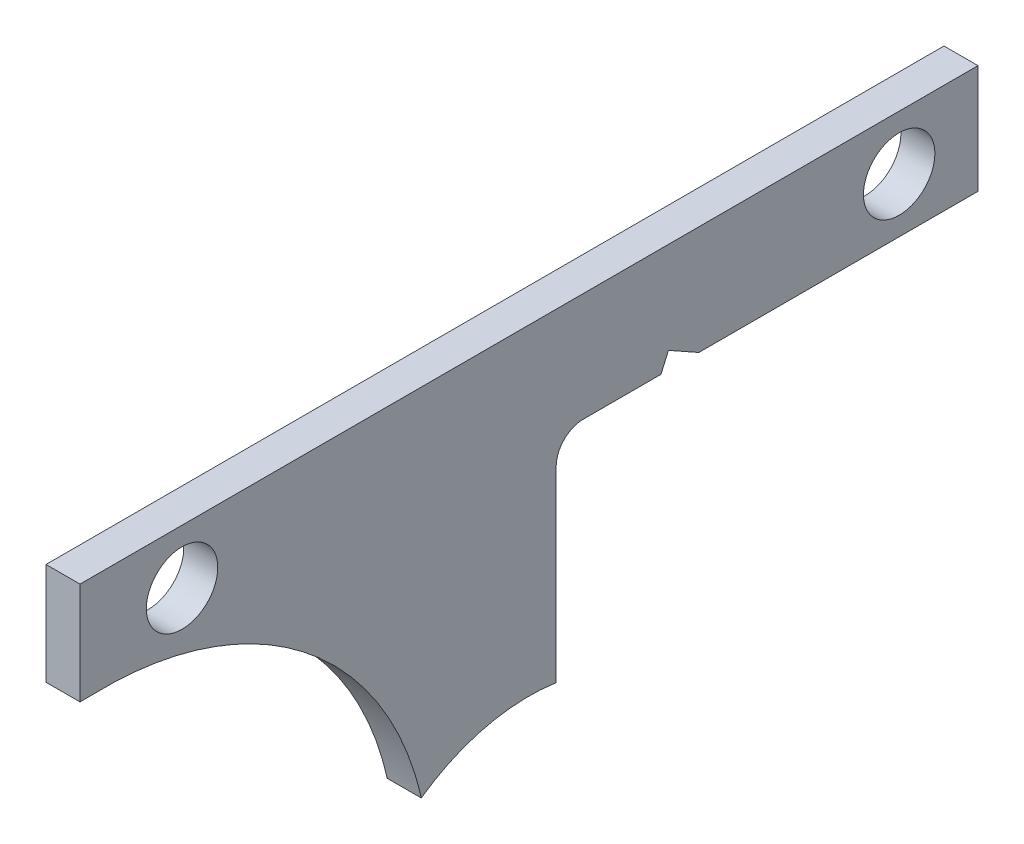
ISO-10303-21;
HEADER;
FILE_DESCRIPTION(('STEP AP214'),'2;1');
FILE_NAME('part.step','',(''),(''),'','','');
FILE_SCHEMA(('AUTOMOTIVE_DESIGN { 1 0 10303 214 1 1 1 1 }'));
ENDSEC;
DATA;
#1=APPLICATION_CONTEXT('core data for automotive mechanical design processes');
#2=APPLICATION_PROTOCOL_DEFINITION('international standard','automotive_design',2000,#1);
#3=PRODUCT_CONTEXT('',#1,'mechanical');
#4=PRODUCT('Part','Part','',(#3));
#5=PRODUCT_RELATED_PRODUCT_CATEGORY('part','',(#4));
#6=PRODUCT_DEFINITION_FORMATION('','',#4);
#7=PRODUCT_DEFINITION_CONTEXT('part definition',#1,'design');
#8=PRODUCT_DEFINITION('design','',#6,#7);
#9=PRODUCT_DEFINITION_SHAPE('','',#8);
#10=(LENGTH_UNIT() NAMED_UNIT(*) SI_UNIT(.MILLI.,.METRE.));
#11=(NAMED_UNIT(*) PLANE_ANGLE_UNIT() SI_UNIT($,.RADIAN.));
#12=(NAMED_UNIT(*) SI_UNIT($,.STERADIAN.) SOLID_ANGLE_UNIT());
#13=UNCERTAINTY_MEASURE_WITH_UNIT(LENGTH_MEASURE(1.E-05),#10,'distance_accuracy_value','');
#14=(GEOMETRIC_REPRESENTATION_CONTEXT(3) GLOBAL_UNCERTAINTY_ASSIGNED_CONTEXT((#13)) GLOBAL_UNIT_ASSIGNED_CONTEXT((#10,
#11,#12)) REPRESENTATION_CONTEXT('',''));
#15=CARTESIAN_POINT('',(0.,0.,0.));
#16=DIRECTION('',(0.,0.,1.));
#17=DIRECTION('',(1.,0.,0.));
#18=AXIS2_PLACEMENT_3D('',#15,#16,#17);
#19=CARTESIAN_POINT('',(-316.5,185.,219.999999999998));
#20=CARTESIAN_POINT('',(-316.5,183.738271044699,181.204081790223));
#21=CARTESIAN_POINT('',(-316.5,145.523335737097,174.397177271133));
#22=CARTESIAN_POINT('',(-321.5,185.,219.999999999998));
#23=CARTESIAN_POINT('',(-321.5,183.738271044699,181.204081790223));
#24=CARTESIAN_POINT('',(-321.5,145.523335737097,174.397177271133));
#25=(BOUNDED_SURFACE() B_SPLINE_SURFACE(1,2,((#19,#20,#21),(#22,#23,#24)),.UNSPECIFIED.,.F.,.F.,
.F.) B_SPLINE_SURFACE_WITH_KNOTS((2,2),(3,3),(-0.0104379405019257,0.0939414645173316),
(0.0325107499581212,1.3945234553188),
.UNSPECIFIED.) GEOMETRIC_REPRESENTATION_ITEM() RATIONAL_B_SPLINE_SURFACE(((1.,0.776939537570949,
1.),(1.,0.776939537570949,1.))) REPRESENTATION_ITEM('') SURFACE());
#26=DIRECTION('',(-1.,0.,0.));
#27=VECTOR('',#26,1.);
#28=CARTESIAN_POINT('',(-319.,147.687279046707,174.834294595081));
#29=LINE('',#28,#27);
#30=CARTESIAN_POINT('',(-316.5,147.687279046707,174.834294595081));
#31=VERTEX_POINT('',#30);
#32=CARTESIAN_POINT('',(-321.5,147.687279046707,174.834294595081));
#33=VERTEX_POINT('',#32);
#34=EDGE_CURVE('E321',#31,#33,#29,.T.);
#35=CARTESIAN_POINT('',(-316.5,185.,219.999999999998));
#36=CARTESIAN_POINT('',(-316.5,183.738271044699,181.204081790223));
#37=CARTESIAN_POINT('',(-316.5,145.523335737097,174.397177271133));
#38=(BOUNDED_CURVE() B_SPLINE_CURVE(2,(#35,#36,#37),.UNSPECIFIED.,.F.,
.F.) B_SPLINE_CURVE_WITH_KNOTS((3,3),(0.0325107499581212,1.3945234553188),
.UNSPECIFIED.) CURVE() GEOMETRIC_REPRESENTATION_ITEM() RATIONAL_B_SPLINE_CURVE((1.,
0.776939537570949,1.)) REPRESENTATION_ITEM(''));
#39=CARTESIAN_POINT('',(-316.5,185.,219.999999999998));
#40=VERTEX_POINT('',#39);
#41=EDGE_CURVE('E71',#40,#31,#38,.T.);
#42=CARTESIAN_POINT('',(-321.5,185.,219.999999999998));
#43=CARTESIAN_POINT('',(-316.5,185.,219.999999999998));
#44=(BOUNDED_CURVE() B_SPLINE_CURVE(1,(#42,#43),.UNSPECIFIED.,.F.,
.F.) B_SPLINE_CURVE_WITH_KNOTS((2,2),(-0.05,0.45),
.UNSPECIFIED.) CURVE() GEOMETRIC_REPRESENTATION_ITEM() RATIONAL_B_SPLINE_CURVE((1.,1.)) REPRESENTATION_ITEM(''));
#45=CARTESIAN_POINT('',(-321.5,185.,219.999999999998));
#46=VERTEX_POINT('',#45);
#47=EDGE_CURVE('E329',#46,#40,#44,.T.);
#48=CARTESIAN_POINT('',(-321.5,145.523335737097,174.397177271133));
#49=CARTESIAN_POINT('',(-321.5,183.738271044699,181.204081790223));
#50=CARTESIAN_POINT('',(-321.5,185.,219.999999999998));
#51=(BOUNDED_CURVE() B_SPLINE_CURVE(2,(#48,#49,#50),.UNSPECIFIED.,.F.,
.F.) B_SPLINE_CURVE_WITH_KNOTS((3,3),(-1.3945234553188,-0.0325107499581212),
.UNSPECIFIED.) CURVE() GEOMETRIC_REPRESENTATION_ITEM() RATIONAL_B_SPLINE_CURVE((1.,
0.776939537570949,1.)) REPRESENTATION_ITEM(''));
#52=EDGE_CURVE('E56',#33,#46,#51,.T.);
#53=ORIENTED_EDGE('',*,*,#34,.F.);
#54=ORIENTED_EDGE('',*,*,#41,.F.);
#55=ORIENTED_EDGE('',*,*,#47,.F.);
#56=ORIENTED_EDGE('',*,*,#52,.F.);
#57=EDGE_LOOP('',(#53,#54,#55,#56));
#58=FACE_BOUND('',#57,.T.);
#59=ADVANCED_FACE('F40',(#58),#25,.T.);
#60=CARTESIAN_POINT('',(-321.5,145.513335737097,225.009999999998));
#61=CARTESIAN_POINT('',(-321.5,145.513335737097,92.9900013881491));
#62=CARTESIAN_POINT('',(-321.5,200.01,225.009999999998));
#63=CARTESIAN_POINT('',(-321.5,200.01,92.9900013881491));
#64=(BOUNDED_SURFACE() B_SPLINE_SURFACE(1,1,((#60,#61),(#62,#63)),.UNSPECIFIED.,.F.,.F.,
.F.) B_SPLINE_SURFACE_WITH_KNOTS((2,2),(2,2),(1.2513335737095,6.70099999999985),
(-6.50099999999984,6.70099986118509),
.UNSPECIFIED.) GEOMETRIC_REPRESENTATION_ITEM() RATIONAL_B_SPLINE_SURFACE(((1.,1.),(1.,1.))) REPRESENTATION_ITEM('') SURFACE());
#65=CARTESIAN_POINT('',(-321.5,145.513335737097,177.509988966474));
#66=CARTESIAN_POINT('',(-321.5,145.860241466454,177.134298435819));
#67=CARTESIAN_POINT('',(-321.5,146.196555668788,176.748831014763));
#68=CARTESIAN_POINT('',(-321.5,146.846977267034,175.959625589369));
#69=CARTESIAN_POINT('',(-321.5,147.161085714723,175.555888451864));
#70=CARTESIAN_POINT('',(-321.5,147.766100139132,174.731397735366));
#71=CARTESIAN_POINT('',(-321.5,148.057006498328,174.310644437049));
#72=CARTESIAN_POINT('',(-321.5,148.614508137317,173.453755060214));
#73=CARTESIAN_POINT('',(-321.5,148.881120474514,173.017630077583));
#74=CARTESIAN_POINT('',(-321.5,149.389422786654,172.13108852765));
#75=CARTESIAN_POINT('',(-321.5,149.63111302594,171.680672112001));
#76=CARTESIAN_POINT('',(-321.5,150.088798717896,170.76700190475));
#77=CARTESIAN_POINT('',(-321.5,150.30479431651,170.303748186083));
#78=CARTESIAN_POINT('',(-321.5,150.811946808464,169.13105253283));
#79=CARTESIAN_POINT('',(-321.5,151.086629618675,168.414415991531));
#80=CARTESIAN_POINT('',(-321.5,151.574666321446,166.960419624229));
#81=CARTESIAN_POINT('',(-321.5,151.788012127372,166.223057079776));
#82=CARTESIAN_POINT('',(-321.5,152.060829394224,165.105731497708));
#83=CARTESIAN_POINT('',(-321.5,152.143903643358,164.731396134757));
#84=CARTESIAN_POINT('',(-321.5,152.294180862767,163.979664303621));
#85=CARTESIAN_POINT('',(-321.5,152.361388302342,163.60226872848));
#86=CARTESIAN_POINT('',(-321.5,152.539056651938,162.466261775463));
#87=CARTESIAN_POINT('',(-321.5,152.625579509606,161.703764946866));
#88=CARTESIAN_POINT('',(-321.5,152.734071839715,160.17434210791));
#89=CARTESIAN_POINT('',(-321.5,152.75604608041,159.407416428906));
#90=CARTESIAN_POINT('',(-321.5,152.735331300627,157.874432850999));
#91=CARTESIAN_POINT('',(-321.5,152.692641765376,157.108374959054));
#92=CARTESIAN_POINT('',(-321.5,152.542837585555,155.582191837762));
#93=CARTESIAN_POINT('',(-321.5,152.43569809475,154.822069010993));
#94=CARTESIAN_POINT('',(-321.5,152.227302617672,153.690928993998));
#95=CARTESIAN_POINT('',(-321.5,152.149886310261,153.315377082177));
#96=CARTESIAN_POINT('',(-321.5,151.979272320893,152.567771500044));
#97=CARTESIAN_POINT('',(-321.5,151.886070584011,152.195718754577));
#98=CARTESIAN_POINT('',(-321.5,151.582988795742,151.085763278693));
#99=CARTESIAN_POINT('',(-321.5,151.349645340784,150.354134772617));
#100=CARTESIAN_POINT('',(-321.5,150.822098015899,148.913161811719));
#101=CARTESIAN_POINT('',(-321.5,150.527894310857,148.203817296529));
#102=CARTESIAN_POINT('',(-321.5,150.042765672565,147.160753487911));
#103=CARTESIAN_POINT('',(-321.5,149.873817839731,146.816672328346));
#104=CARTESIAN_POINT('',(-321.5,149.521622068503,146.136022145836));
#105=CARTESIAN_POINT('',(-321.5,149.33837769065,145.799451279144));
#106=CARTESIAN_POINT('',(-321.5,148.767716705446,144.801980083519));
#107=CARTESIAN_POINT('',(-321.5,148.359207392565,144.152966834919));
#108=CARTESIAN_POINT('',(-321.5,147.558249285969,142.992001693596));
#109=CARTESIAN_POINT('',(-321.5,147.173560866825,142.47465651788));
#110=CARTESIAN_POINT('',(-321.5,146.369256624312,141.469379602389));
#111=CARTESIAN_POINT('',(-321.5,145.9497041391,140.981397184952));
#112=CARTESIAN_POINT('',(-321.5,145.513335737097,140.508832183142));
#113=B_SPLINE_CURVE_WITH_KNOTS('',3,(#65,#66,#67,#68,#69,#70,#71,#72,#73,#74,#75,#76,#77,#78,
#79,#80,#81,#82,#83,#84,#85,#86,#87,#88,#89,#90,#91,#92,#93,#94,#95,#96,#97,#98,#99,#100,#101,
#102,#103,#104,#105,#106,#107,#108,#109,#110,#111,#112),.UNSPECIFIED.,.F.,.F.,(4,2,2,2,2,2,2,2,
2,2,2,2,2,2,2,2,2,2,2,2,2,2,2,4),(0.,1.53386844719917,3.06766419382686,4.60143465124385,
6.13411977790311,7.66678864599599,9.19944880817018,11.4990462738099,13.7989467781926,
14.9489769834336,16.0986828651578,18.397893864168,20.696935014467,22.9959944670275,
25.2959408032635,26.4459921466843,27.5963393618507,29.8972510869391,32.1981565783829,
33.3478196537988,34.4971973150747,36.7947839511575,38.7273274218922,40.6564337056598),.UNSPECIFIED.);
#114=CARTESIAN_POINT('',(-321.5,152.451843034107,155.));
#115=VERTEX_POINT('',#114);
#116=EDGE_CURVE('E62',#33,#115,#113,.T.);
#117=CARTESIAN_POINT('',(-321.5,185.,219.999999999998));
#118=CARTESIAN_POINT('',(-321.5,185.,224.999999999998));
#119=(BOUNDED_CURVE() B_SPLINE_CURVE(1,(#117,#118),.UNSPECIFIED.,.F.,
.F.) B_SPLINE_CURVE_WITH_KNOTS((2,2),(2.99999999999992,3.49999999999992),
.UNSPECIFIED.) CURVE() GEOMETRIC_REPRESENTATION_ITEM() RATIONAL_B_SPLINE_CURVE((1.,1.)) REPRESENTATION_ITEM(''));
#120=CARTESIAN_POINT('',(-321.5,185.,224.999999999998));
#121=VERTEX_POINT('',#120);
#122=EDGE_CURVE('E216',#46,#121,#119,.T.);
#123=CARTESIAN_POINT('',(-321.5,200.,224.999999999998));
#124=CARTESIAN_POINT('',(-321.5,185.,224.999999999998));
#125=(BOUNDED_CURVE() B_SPLINE_CURVE(1,(#123,#124),.UNSPECIFIED.,.F.,
.F.) B_SPLINE_CURVE_WITH_KNOTS((2,2),(-3.29999999999992,-1.79999999999992),
.UNSPECIFIED.) CURVE() GEOMETRIC_REPRESENTATION_ITEM() RATIONAL_B_SPLINE_CURVE((1.,1.)) REPRESENTATION_ITEM(''));
#126=CARTESIAN_POINT('',(-321.5,200.,224.999999999998));
#127=VERTEX_POINT('',#126);
#128=EDGE_CURVE('E147',#127,#121,#125,.T.);
#129=CARTESIAN_POINT('',(-321.5,200.,93.0000013881491));
#130=CARTESIAN_POINT('',(-321.5,200.,224.999999999998));
#131=(BOUNDED_CURVE() B_SPLINE_CURVE(1,(#129,#130),.UNSPECIFIED.,.F.,
.F.) B_SPLINE_CURVE_WITH_KNOTS((2,2),(-3.7000609657488,9.49993889543614),
.UNSPECIFIED.) CURVE() GEOMETRIC_REPRESENTATION_ITEM() RATIONAL_B_SPLINE_CURVE((1.,1.)) REPRESENTATION_ITEM(''));
#132=CARTESIAN_POINT('',(-321.5,200.,93.0000013881491));
#133=VERTEX_POINT('',#132);
#134=EDGE_CURVE('E152',#133,#127,#131,.T.);
#135=CARTESIAN_POINT('',(-321.5,184.000001489994,93.0000013881491));
#136=CARTESIAN_POINT('',(-321.5,200.,93.0000013881491));
#137=(BOUNDED_CURVE() B_SPLINE_CURVE(1,(#135,#136),.UNSPECIFIED.,.F.,
.F.) B_SPLINE_CURVE_WITH_KNOTS((2,2),(2.45000014899932,4.04999999999992),
.UNSPECIFIED.) CURVE() GEOMETRIC_REPRESENTATION_ITEM() RATIONAL_B_SPLINE_CURVE((1.,1.)) REPRESENTATION_ITEM(''));
#138=CARTESIAN_POINT('',(-321.5,184.000001489994,93.0000013881491));
#139=VERTEX_POINT('',#138);
#140=EDGE_CURVE('E320',#139,#133,#137,.T.);
#141=CARTESIAN_POINT('',(-321.5,184.000001489994,93.0000013881491));
#142=CARTESIAN_POINT('',(-321.5,184.000001489994,134.029372648002));
#143=(BOUNDED_CURVE() B_SPLINE_CURVE(1,(#141,#142),.UNSPECIFIED.,.F.,
.F.) B_SPLINE_CURVE_WITH_KNOTS((2,2),(-6.19999986118509,-2.09706273519983),
.UNSPECIFIED.) CURVE() GEOMETRIC_REPRESENTATION_ITEM() RATIONAL_B_SPLINE_CURVE((1.,1.)) REPRESENTATION_ITEM(''));
#144=CARTESIAN_POINT('',(-321.5,184.000001489994,134.029372648002));
#145=VERTEX_POINT('',#144);
#146=EDGE_CURVE('E208',#139,#145,#143,.T.);
#147=CARTESIAN_POINT('',(-321.5,184.000001489994,134.029372648002));
#148=CARTESIAN_POINT('',(-321.5,186.499999798834,138.499999679625));
#149=(BOUNDED_CURVE() B_SPLINE_CURVE(1,(#147,#148),.UNSPECIFIED.,.F.,
.F.) B_SPLINE_CURVE_WITH_KNOTS((2,2),(-0.144876145952486,0.367339605465649),
.UNSPECIFIED.) CURVE() GEOMETRIC_REPRESENTATION_ITEM() RATIONAL_B_SPLINE_CURVE((1.,1.)) REPRESENTATION_ITEM(''));
#150=CARTESIAN_POINT('',(-321.5,186.499999798834,138.499999679625));
#151=VERTEX_POINT('',#150);
#152=EDGE_CURVE('E217',#145,#151,#149,.T.);
#153=CARTESIAN_POINT('',(-321.5,186.499999798834,138.499999679625));
#154=CARTESIAN_POINT('',(-321.5,184.000001489994,139.600149694138));
#155=(BOUNDED_CURVE() B_SPLINE_CURVE(1,(#153,#154),.UNSPECIFIED.,.F.,
.F.) B_SPLINE_CURVE_WITH_KNOTS((2,2),(-3.01797486716644,-2.74483897427363),
.UNSPECIFIED.) CURVE() GEOMETRIC_REPRESENTATION_ITEM() RATIONAL_B_SPLINE_CURVE((1.,1.)) REPRESENTATION_ITEM(''));
#156=CARTESIAN_POINT('',(-321.5,184.000001489994,139.600149694138));
#157=VERTEX_POINT('',#156);
#158=EDGE_CURVE('E180',#151,#157,#155,.T.);
#159=CARTESIAN_POINT('',(-321.5,184.000001489994,139.600149694138));
#160=CARTESIAN_POINT('',(-321.5,184.000001489994,151.));
#161=(BOUNDED_CURVE() B_SPLINE_CURVE(1,(#159,#160),.UNSPECIFIED.,.F.,
.F.) B_SPLINE_CURVE_WITH_KNOTS((2,2),(-1.28998503058624,-0.150000000000003),
.UNSPECIFIED.) CURVE() GEOMETRIC_REPRESENTATION_ITEM() RATIONAL_B_SPLINE_CURVE((1.,1.)) REPRESENTATION_ITEM(''));
#162=CARTESIAN_POINT('',(-321.5,184.000001489994,151.));
#163=VERTEX_POINT('',#162);
#164=EDGE_CURVE('E176',#157,#163,#161,.T.);
#165=CARTESIAN_POINT('',(-321.5,180.000001489994,155.));
#166=CARTESIAN_POINT('',(-321.5,184.000001489994,155.));
#167=CARTESIAN_POINT('',(-321.5,184.000001489994,151.));
#168=(BOUNDED_CURVE() B_SPLINE_CURVE(2,(#165,#166,#167),.UNSPECIFIED.,.F.,
.F.) B_SPLINE_CURVE_WITH_KNOTS((3,3),(-0.785398163397449,0.785398163397448),
.UNSPECIFIED.) CURVE() GEOMETRIC_REPRESENTATION_ITEM() RATIONAL_B_SPLINE_CURVE((1.,
0.707106781186548,1.)) REPRESENTATION_ITEM(''));
#169=CARTESIAN_POINT('',(-321.5,180.000001489994,155.));
#170=VERTEX_POINT('',#169);
#171=EDGE_CURVE('E161',#170,#163,#168,.T.);
#172=CARTESIAN_POINT('',(-321.5,150.42810164539,155.));
#173=CARTESIAN_POINT('',(-321.5,180.000001489994,155.));
#174=(BOUNDED_CURVE() B_SPLINE_CURVE(1,(#172,#173),.UNSPECIFIED.,.F.,
.F.) B_SPLINE_CURVE_WITH_KNOTS((2,2),(0.868885329190994,3.82607531365144),
.UNSPECIFIED.) CURVE() GEOMETRIC_REPRESENTATION_ITEM() RATIONAL_B_SPLINE_CURVE((1.,1.)) REPRESENTATION_ITEM(''));
#175=EDGE_CURVE('E373',#115,#170,#174,.T.);
#176=CARTESIAN_POINT('',(-321.5,186.750000000002,210.));
#177=CARTESIAN_POINT('',(-321.5,186.750000000002,204.75));
#178=CARTESIAN_POINT('',(-321.5,192.000000000002,204.75));
#179=CARTESIAN_POINT('',(-321.5,197.250000000002,204.75));
#180=CARTESIAN_POINT('',(-321.5,197.250000000002,210.));
#181=CARTESIAN_POINT('',(-321.5,197.250000000002,215.25));
#182=CARTESIAN_POINT('',(-321.5,192.000000000002,215.25));
#183=CARTESIAN_POINT('',(-321.5,186.750000000002,215.25));
#184=CARTESIAN_POINT('',(-321.5,186.750000000002,210.));
#185=(BOUNDED_CURVE() B_SPLINE_CURVE(2,(#176,#177,#178,#179,#180,#181,#182,#183,#184),
.UNSPECIFIED.,.T.,.F.) B_SPLINE_CURVE_WITH_KNOTS((3,2,2,2,3),(-3.14159265358979,
-1.5707963267949,0.,1.5707963267949,3.14159265358979),
.UNSPECIFIED.) CURVE() GEOMETRIC_REPRESENTATION_ITEM() RATIONAL_B_SPLINE_CURVE((1.,
0.707106781186547,1.,0.707106781186547,1.,0.707106781186547,1.,0.707106781186547,1.)) REPRESENTATION_ITEM(''));
#186=CARTESIAN_POINT('',(-321.5,186.750000000002,210.));
#187=VERTEX_POINT('',#186);
#188=EDGE_CURVE('E185',#187,#187,#185,.T.);
#189=CARTESIAN_POINT('',(-321.5,186.750000000002,104.591492462718));
#190=CARTESIAN_POINT('',(-321.5,186.750000000002,99.3414924627182));
#191=CARTESIAN_POINT('',(-321.5,192.000000000002,99.3414924627182));
#192=CARTESIAN_POINT('',(-321.5,197.250000000002,99.3414924627182));
#193=CARTESIAN_POINT('',(-321.5,197.250000000002,104.591492462718));
#194=CARTESIAN_POINT('',(-321.5,197.250000000002,109.841492462718));
#195=CARTESIAN_POINT('',(-321.5,192.000000000002,109.841492462718));
#196=CARTESIAN_POINT('',(-321.5,186.750000000002,109.841492462718));
#197=CARTESIAN_POINT('',(-321.5,186.750000000002,104.591492462718));
#198=(BOUNDED_CURVE() B_SPLINE_CURVE(2,(#189,#190,#191,#192,#193,#194,#195,#196,#197),
.UNSPECIFIED.,.T.,.F.) B_SPLINE_CURVE_WITH_KNOTS((3,2,2,2,3),(-3.14159265358979,
-1.5707963267949,0.,1.5707963267949,3.14159265358979),
.UNSPECIFIED.) CURVE() GEOMETRIC_REPRESENTATION_ITEM() RATIONAL_B_SPLINE_CURVE((1.,
0.707106781186547,1.,0.707106781186547,1.,0.707106781186547,1.,0.707106781186547,1.)) REPRESENTATION_ITEM(''));
#199=CARTESIAN_POINT('',(-321.5,186.750000000002,104.591492462718));
#200=VERTEX_POINT('',#199);
#201=EDGE_CURVE('E280',#200,#200,#198,.T.);
#202=ORIENTED_EDGE('',*,*,#116,.F.);
#203=ORIENTED_EDGE('',*,*,#52,.T.);
#204=ORIENTED_EDGE('',*,*,#122,.T.);
#205=ORIENTED_EDGE('',*,*,#128,.F.);
#206=ORIENTED_EDGE('',*,*,#134,.F.);
#207=ORIENTED_EDGE('',*,*,#140,.F.);
#208=ORIENTED_EDGE('',*,*,#146,.T.);
#209=ORIENTED_EDGE('',*,*,#152,.T.);
#210=ORIENTED_EDGE('',*,*,#158,.T.);
#211=ORIENTED_EDGE('',*,*,#164,.T.);
#212=ORIENTED_EDGE('',*,*,#171,.F.);
#213=ORIENTED_EDGE('',*,*,#175,.F.);
#214=EDGE_LOOP('',(#202,#203,#204,#205,#206,#207,#208,#209,#210,#211,#212,#213));
#215=FACE_BOUND('',#214,.T.);
#216=ORIENTED_EDGE('',*,*,#188,.T.);
#217=EDGE_LOOP('',(#216));
#218=FACE_BOUND('',#217,.T.);
#219=ORIENTED_EDGE('',*,*,#201,.T.);
#220=EDGE_LOOP('',(#219));
#221=FACE_BOUND('',#220,.T.);
#222=ADVANCED_FACE('F177',(#215,#218,#221),#64,.T.);
#223=CARTESIAN_POINT('',(-321.51,185.,219.989999999998));
#224=CARTESIAN_POINT('',(-321.51,185.,225.009999999998));
#225=CARTESIAN_POINT('',(-316.49,185.,219.989999999998));
#226=CARTESIAN_POINT('',(-316.49,185.,225.009999999998));
#227=(BOUNDED_SURFACE() B_SPLINE_SURFACE(1,1,((#223,#224),(#225,#226)),.UNSPECIFIED.,.F.,.F.,
.F.) B_SPLINE_SURFACE_WITH_KNOTS((2,2),(2,2),(-0.051,0.451),(-0.001,0.501),
.UNSPECIFIED.) GEOMETRIC_REPRESENTATION_ITEM() RATIONAL_B_SPLINE_SURFACE(((1.,1.),(1.,1.))) REPRESENTATION_ITEM('') SURFACE());
#228=CARTESIAN_POINT('',(-316.5,185.,219.999999999998));
#229=CARTESIAN_POINT('',(-316.5,185.,224.999999999998));
#230=(BOUNDED_CURVE() B_SPLINE_CURVE(1,(#228,#229),.UNSPECIFIED.,.F.,
.F.) B_SPLINE_CURVE_WITH_KNOTS((2,2),(2.99999999999992,3.49999999999992),
.UNSPECIFIED.) CURVE() GEOMETRIC_REPRESENTATION_ITEM() RATIONAL_B_SPLINE_CURVE((1.,1.)) REPRESENTATION_ITEM(''));
#231=CARTESIAN_POINT('',(-316.5,185.,224.999999999998));
#232=VERTEX_POINT('',#231);
#233=EDGE_CURVE('E204',#40,#232,#230,.T.);
#234=CARTESIAN_POINT('',(-321.5,185.,224.999999999998));
#235=CARTESIAN_POINT('',(-316.5,185.,224.999999999998));
#236=(BOUNDED_CURVE() B_SPLINE_CURVE(1,(#234,#235),.UNSPECIFIED.,.F.,
.F.) B_SPLINE_CURVE_WITH_KNOTS((2,2),(-0.05,0.45),
.UNSPECIFIED.) CURVE() GEOMETRIC_REPRESENTATION_ITEM() RATIONAL_B_SPLINE_CURVE((1.,1.)) REPRESENTATION_ITEM(''));
#237=EDGE_CURVE('E342',#121,#232,#236,.T.);
#238=ORIENTED_EDGE('',*,*,#122,.F.);
#239=ORIENTED_EDGE('',*,*,#47,.T.);
#240=ORIENTED_EDGE('',*,*,#233,.T.);
#241=ORIENTED_EDGE('',*,*,#237,.F.);
#242=EDGE_LOOP('',(#238,#239,#240,#241));
#243=FACE_BOUND('',#242,.T.);
#244=ADVANCED_FACE('F661',(#243),#227,.T.);
#245=CARTESIAN_POINT('',(-316.49,184.99,224.999999999998));
#246=CARTESIAN_POINT('',(-321.51,184.99,224.999999999998));
#247=CARTESIAN_POINT('',(-316.49,200.01,224.999999999998));
#248=CARTESIAN_POINT('',(-321.51,200.01,224.999999999998));
#249=(BOUNDED_SURFACE() B_SPLINE_SURFACE(1,1,((#245,#246),(#247,#248)),.UNSPECIFIED.,.F.,.F.,
.F.) B_SPLINE_SURFACE_WITH_KNOTS((2,2),(2,2),(-1.601,-0.099),(-0.451,0.051),
.UNSPECIFIED.) GEOMETRIC_REPRESENTATION_ITEM() RATIONAL_B_SPLINE_SURFACE(((1.,1.),(1.,1.))) REPRESENTATION_ITEM('') SURFACE());
#250=CARTESIAN_POINT('',(-316.5,185.,224.999999999998));
#251=CARTESIAN_POINT('',(-316.5,200.,224.999999999998));
#252=(BOUNDED_CURVE() B_SPLINE_CURVE(1,(#250,#251),.UNSPECIFIED.,.F.,
.F.) B_SPLINE_CURVE_WITH_KNOTS((2,2),(1.79999999999992,3.29999999999992),
.UNSPECIFIED.) CURVE() GEOMETRIC_REPRESENTATION_ITEM() RATIONAL_B_SPLINE_CURVE((1.,1.)) REPRESENTATION_ITEM(''));
#253=CARTESIAN_POINT('',(-316.5,200.,224.999999999998));
#254=VERTEX_POINT('',#253);
#255=EDGE_CURVE('E241',#232,#254,#252,.T.);
#256=CARTESIAN_POINT('',(-316.5,200.,224.999999999998));
#257=CARTESIAN_POINT('',(-321.5,200.,224.999999999998));
#258=(BOUNDED_CURVE() B_SPLINE_CURVE(1,(#256,#257),.UNSPECIFIED.,.F.,
.F.) B_SPLINE_CURVE_WITH_KNOTS((2,2),(-0.45,0.05),
.UNSPECIFIED.) CURVE() GEOMETRIC_REPRESENTATION_ITEM() RATIONAL_B_SPLINE_CURVE((1.,1.)) REPRESENTATION_ITEM(''));
#259=EDGE_CURVE('E126',#254,#127,#258,.T.);
#260=ORIENTED_EDGE('',*,*,#237,.T.);
#261=ORIENTED_EDGE('',*,*,#255,.T.);
#262=ORIENTED_EDGE('',*,*,#259,.T.);
#263=ORIENTED_EDGE('',*,*,#128,.T.);
#264=EDGE_LOOP('',(#260,#261,#262,#263));
#265=FACE_BOUND('',#264,.T.);
#266=ADVANCED_FACE('F656',(#265),#249,.T.);
#267=CARTESIAN_POINT('',(-316.49,183.995120737495,134.020644632475));
#268=CARTESIAN_POINT('',(-321.51,183.995120737495,134.020644632475));
#269=CARTESIAN_POINT('',(-316.49,186.504880551334,138.508727695152));
#270=CARTESIAN_POINT('',(-321.51,186.504880551334,138.508727695152));
#271=(BOUNDED_SURFACE() B_SPLINE_SURFACE(1,1,((#267,#268),(#269,#270)),.UNSPECIFIED.,.F.,.F.,
.F.) B_SPLINE_SURFACE_WITH_KNOTS((2,2),(2,2),(-0.0010000000000005,0.513215751418136),(-0.051,
0.451),.UNSPECIFIED.) GEOMETRIC_REPRESENTATION_ITEM() RATIONAL_B_SPLINE_SURFACE(((1.,1.),(1.,1.))) REPRESENTATION_ITEM('') SURFACE());
#272=CARTESIAN_POINT('',(-316.5,186.499999798834,138.499999679625));
#273=CARTESIAN_POINT('',(-316.5,184.000002920505,134.029375206115));
#274=(BOUNDED_CURVE() B_SPLINE_CURVE(1,(#272,#273),.UNSPECIFIED.,.F.,
.F.) B_SPLINE_CURVE_WITH_KNOTS((2,2),(-0.367339605465649,0.144875852860258),
.UNSPECIFIED.) CURVE() GEOMETRIC_REPRESENTATION_ITEM() RATIONAL_B_SPLINE_CURVE((1.,1.)) REPRESENTATION_ITEM(''));
#275=CARTESIAN_POINT('',(-316.5,186.499999798834,138.499999679625));
#276=VERTEX_POINT('',#275);
#277=CARTESIAN_POINT('',(-316.5,184.000001489994,134.029372648002));
#278=VERTEX_POINT('',#277);
#279=EDGE_CURVE('E118',#276,#278,#274,.T.);
#280=CARTESIAN_POINT('',(-316.5,186.499999798834,138.499999679625));
#281=CARTESIAN_POINT('',(-321.5,186.499999798834,138.499999679625));
#282=(BOUNDED_CURVE() B_SPLINE_CURVE(1,(#280,#281),.UNSPECIFIED.,.F.,
.F.) B_SPLINE_CURVE_WITH_KNOTS((2,2),(-0.05,0.45),
.UNSPECIFIED.) CURVE() GEOMETRIC_REPRESENTATION_ITEM() RATIONAL_B_SPLINE_CURVE((1.,1.)) REPRESENTATION_ITEM(''));
#283=EDGE_CURVE('E395',#276,#151,#282,.T.);
#284=CARTESIAN_POINT('',(-316.5,184.000001489994,134.029372648002));
#285=CARTESIAN_POINT('',(-321.5,184.000001489994,134.029372648002));
#286=(BOUNDED_CURVE() B_SPLINE_CURVE(1,(#284,#285),.UNSPECIFIED.,.F.,
.F.) B_SPLINE_CURVE_WITH_KNOTS((2,2),(-0.25,0.25),
.UNSPECIFIED.) CURVE() GEOMETRIC_REPRESENTATION_ITEM() RATIONAL_B_SPLINE_CURVE((1.,1.)) REPRESENTATION_ITEM(''));
#287=EDGE_CURVE('E262',#278,#145,#286,.T.);
#288=ORIENTED_EDGE('',*,*,#279,.F.);
#289=ORIENTED_EDGE('',*,*,#283,.T.);
#290=ORIENTED_EDGE('',*,*,#152,.F.);
#291=ORIENTED_EDGE('',*,*,#287,.F.);
#292=EDGE_LOOP('',(#288,#289,#290,#291));
#293=FACE_BOUND('',#292,.T.);
#294=ADVANCED_FACE('F641',(#293),#271,.T.);
#295=CARTESIAN_POINT('',(-316.49,186.509152745678,138.495971831059));
#296=CARTESIAN_POINT('',(-321.51,186.509152745678,138.495971831059));
#297=CARTESIAN_POINT('',(-316.49,183.99084854315,139.604177542704));
#298=CARTESIAN_POINT('',(-321.51,183.99084854315,139.604177542704));
#299=(BOUNDED_SURFACE() B_SPLINE_SURFACE(1,1,((#295,#296),(#297,#298)),.UNSPECIFIED.,.F.,.F.,
.F.) B_SPLINE_SURFACE_WITH_KNOTS((2,2),(2,2),(-0.00100015628954575,0.274135736603264),(-0.051,
0.451),.UNSPECIFIED.) GEOMETRIC_REPRESENTATION_ITEM() RATIONAL_B_SPLINE_SURFACE(((1.,1.),(1.,1.))) REPRESENTATION_ITEM('') SURFACE());
#300=CARTESIAN_POINT('',(-316.5,184.000001489994,139.600149694138));
#301=CARTESIAN_POINT('',(-316.5,186.499999798834,138.499999679625));
#302=(BOUNDED_CURVE() B_SPLINE_CURVE(1,(#300,#301),.UNSPECIFIED.,.F.,
.F.) B_SPLINE_CURVE_WITH_KNOTS((2,2),(2.74483897427363,3.01797486716644),
.UNSPECIFIED.) CURVE() GEOMETRIC_REPRESENTATION_ITEM() RATIONAL_B_SPLINE_CURVE((1.,1.)) REPRESENTATION_ITEM(''));
#303=CARTESIAN_POINT('',(-316.5,184.000001489994,139.600149694138));
#304=VERTEX_POINT('',#303);
#305=EDGE_CURVE('E357',#304,#276,#302,.T.);
#306=CARTESIAN_POINT('',(-321.5,184.000001489994,139.600149694138));
#307=CARTESIAN_POINT('',(-316.5,184.000001489994,139.600149694138));
#308=(BOUNDED_CURVE() B_SPLINE_CURVE(1,(#306,#307),.UNSPECIFIED.,.F.,
.F.) B_SPLINE_CURVE_WITH_KNOTS((2,2),(-0.25,0.25),
.UNSPECIFIED.) CURVE() GEOMETRIC_REPRESENTATION_ITEM() RATIONAL_B_SPLINE_CURVE((1.,1.)) REPRESENTATION_ITEM(''));
#309=EDGE_CURVE('E225',#157,#304,#308,.T.);
#310=ORIENTED_EDGE('',*,*,#305,.F.);
#311=ORIENTED_EDGE('',*,*,#309,.F.);
#312=ORIENTED_EDGE('',*,*,#158,.F.);
#313=ORIENTED_EDGE('',*,*,#283,.F.);
#314=EDGE_LOOP('',(#310,#311,#312,#313));
#315=FACE_BOUND('',#314,.T.);
#316=ADVANCED_FACE('F625',(#315),#299,.T.);
#317=CARTESIAN_POINT('',(-321.51,184.000001489994,134.039372648002));
#318=CARTESIAN_POINT('',(-316.49,184.000001489994,134.039372648002));
#319=CARTESIAN_POINT('',(-321.51,184.000001489994,92.9900013881491));
#320=CARTESIAN_POINT('',(-316.49,184.000001489994,92.9900013881491));
#321=(BOUNDED_SURFACE() B_SPLINE_SURFACE(1,1,((#317,#318),(#319,#320)),.UNSPECIFIED.,.F.,.F.,
.F.) B_SPLINE_SURFACE_WITH_KNOTS((2,2),(2,2),(1.59606273519983,5.70099986118508),(-0.051,0.451),
.UNSPECIFIED.) GEOMETRIC_REPRESENTATION_ITEM() RATIONAL_B_SPLINE_SURFACE(((1.,1.),(1.,1.))) REPRESENTATION_ITEM('') SURFACE());
#322=CARTESIAN_POINT('',(-321.5,184.000001489994,93.0000013881491));
#323=CARTESIAN_POINT('',(-316.5,184.000001489994,93.0000013881491));
#324=(BOUNDED_CURVE() B_SPLINE_CURVE(1,(#322,#323),.UNSPECIFIED.,.F.,
.F.) B_SPLINE_CURVE_WITH_KNOTS((2,2),(-0.05,0.45),
.UNSPECIFIED.) CURVE() GEOMETRIC_REPRESENTATION_ITEM() RATIONAL_B_SPLINE_CURVE((1.,1.)) REPRESENTATION_ITEM(''));
#325=CARTESIAN_POINT('',(-316.5,184.000001489994,93.0000013881491));
#326=VERTEX_POINT('',#325);
#327=EDGE_CURVE('E253',#139,#326,#324,.T.);
#328=CARTESIAN_POINT('',(-316.5,184.000001489994,134.029372648002));
#329=CARTESIAN_POINT('',(-316.5,184.000001489994,93.0000013881491));
#330=(BOUNDED_CURVE() B_SPLINE_CURVE(1,(#328,#329),.UNSPECIFIED.,.F.,
.F.) B_SPLINE_CURVE_WITH_KNOTS((2,2),(2.09706273519983,6.19999986118509),
.UNSPECIFIED.) CURVE() GEOMETRIC_REPRESENTATION_ITEM() RATIONAL_B_SPLINE_CURVE((1.,1.)) REPRESENTATION_ITEM(''));
#331=EDGE_CURVE('E251',#278,#326,#330,.T.);
#332=ORIENTED_EDGE('',*,*,#287,.T.);
#333=ORIENTED_EDGE('',*,*,#146,.F.);
#334=ORIENTED_EDGE('',*,*,#327,.T.);
#335=ORIENTED_EDGE('',*,*,#331,.F.);
#336=EDGE_LOOP('',(#332,#333,#334,#335));
#337=FACE_BOUND('',#336,.T.);
#338=ADVANCED_FACE('F607',(#337),#321,.T.);
#339=CARTESIAN_POINT('',(-321.51,184.000001489994,151.01));
#340=CARTESIAN_POINT('',(-316.49,184.000001489994,151.01));
#341=CARTESIAN_POINT('',(-321.51,184.000001489994,139.590149694138));
#342=CARTESIAN_POINT('',(-316.49,184.000001489994,139.590149694138));
#343=(BOUNDED_SURFACE() B_SPLINE_SURFACE(1,1,((#339,#340),(#341,#342)),.UNSPECIFIED.,.F.,.F.,
.F.) B_SPLINE_SURFACE_WITH_KNOTS((2,2),(2,2),(-0.601,0.540985030586231),(-0.051,0.451),
.UNSPECIFIED.) GEOMETRIC_REPRESENTATION_ITEM() RATIONAL_B_SPLINE_SURFACE(((1.,1.),(1.,1.))) REPRESENTATION_ITEM('') SURFACE());
#344=CARTESIAN_POINT('',(-316.5,184.000001489994,151.));
#345=CARTESIAN_POINT('',(-316.5,184.000001489994,139.600149694138));
#346=(BOUNDED_CURVE() B_SPLINE_CURVE(1,(#344,#345),.UNSPECIFIED.,.F.,
.F.) B_SPLINE_CURVE_WITH_KNOTS((2,2),(0.150000000000003,1.28998503058624),
.UNSPECIFIED.) CURVE() GEOMETRIC_REPRESENTATION_ITEM() RATIONAL_B_SPLINE_CURVE((1.,1.)) REPRESENTATION_ITEM(''));
#347=CARTESIAN_POINT('',(-316.5,184.000001489994,151.));
#348=VERTEX_POINT('',#347);
#349=EDGE_CURVE('E189',#348,#304,#346,.T.);
#350=CARTESIAN_POINT('',(-321.5,184.000001489994,151.));
#351=CARTESIAN_POINT('',(-316.5,184.000001489994,151.));
#352=(BOUNDED_CURVE() B_SPLINE_CURVE(1,(#350,#351),.UNSPECIFIED.,.F.,
.F.) B_SPLINE_CURVE_WITH_KNOTS((2,2),(-0.05,0.45),
.UNSPECIFIED.) CURVE() GEOMETRIC_REPRESENTATION_ITEM() RATIONAL_B_SPLINE_CURVE((1.,1.)) REPRESENTATION_ITEM(''));
#353=EDGE_CURVE('E166',#163,#348,#352,.T.);
#354=ORIENTED_EDGE('',*,*,#309,.T.);
#355=ORIENTED_EDGE('',*,*,#349,.F.);
#356=ORIENTED_EDGE('',*,*,#353,.F.);
#357=ORIENTED_EDGE('',*,*,#164,.F.);
#358=EDGE_LOOP('',(#354,#355,#356,#357));
#359=FACE_BOUND('',#358,.T.);
#360=ADVANCED_FACE('F187',(#359),#343,.T.);
#361=CARTESIAN_POINT('',(-316.5,200.01,225.009999999998));
#362=CARTESIAN_POINT('',(-316.5,200.01,92.9900013881491));
#363=CARTESIAN_POINT('',(-316.5,145.513335737097,225.009999999998));
#364=CARTESIAN_POINT('',(-316.5,145.513335737097,92.9900013881491));
#365=(BOUNDED_SURFACE() B_SPLINE_SURFACE(1,1,((#361,#362),(#363,#364)),.UNSPECIFIED.,.F.,.F.,
.F.) B_SPLINE_SURFACE_WITH_KNOTS((2,2),(2,2),(1.2513335737095,6.70099999999985),
(-6.50099999999984,6.70099986118509),
.UNSPECIFIED.) GEOMETRIC_REPRESENTATION_ITEM() RATIONAL_B_SPLINE_SURFACE(((1.,1.),(1.,1.))) REPRESENTATION_ITEM('') SURFACE());
#366=CARTESIAN_POINT('',(-316.5,125.476378776776,159.009410574808));
#367=DIRECTION('',(1.,0.,0.));
#368=DIRECTION('',(0.,0.,-1.));
#369=AXIS2_PLACEMENT_3D('',#366,#367,#368);
#370=CIRCLE('',#369,27.2717994466066);
#371=CARTESIAN_POINT('',(-316.5,152.451843034107,155.));
#372=VERTEX_POINT('',#371);
#373=EDGE_CURVE('E832',#372,#31,#370,.T.);
#374=CARTESIAN_POINT('',(-316.5,150.42810164539,155.));
#375=CARTESIAN_POINT('',(-316.5,180.000001489994,155.));
#376=(BOUNDED_CURVE() B_SPLINE_CURVE(1,(#374,#375),.UNSPECIFIED.,.F.,
.F.) B_SPLINE_CURVE_WITH_KNOTS((2,2),(0.868885329190994,3.82607531365144),
.UNSPECIFIED.) CURVE() GEOMETRIC_REPRESENTATION_ITEM() RATIONAL_B_SPLINE_CURVE((1.,1.)) REPRESENTATION_ITEM(''));
#377=CARTESIAN_POINT('',(-316.5,180.000001489994,155.));
#378=VERTEX_POINT('',#377);
#379=EDGE_CURVE('E226',#372,#378,#376,.T.);
#380=CARTESIAN_POINT('',(-316.5,184.000001489994,151.));
#381=CARTESIAN_POINT('',(-316.5,184.000001489994,155.));
#382=CARTESIAN_POINT('',(-316.5,180.000001489994,155.));
#383=(BOUNDED_CURVE() B_SPLINE_CURVE(2,(#380,#381,#382),.UNSPECIFIED.,.F.,
.F.) B_SPLINE_CURVE_WITH_KNOTS((3,3),(-0.785398163397448,0.785398163397449),
.UNSPECIFIED.) CURVE() GEOMETRIC_REPRESENTATION_ITEM() RATIONAL_B_SPLINE_CURVE((1.,
0.707106781186548,1.)) REPRESENTATION_ITEM(''));
#384=EDGE_CURVE('E192',#348,#378,#383,.T.);
#385=CARTESIAN_POINT('',(-316.5,184.000001489994,93.0000013881491));
#386=CARTESIAN_POINT('',(-316.5,200.,93.0000013881491));
#387=(BOUNDED_CURVE() B_SPLINE_CURVE(1,(#385,#386),.UNSPECIFIED.,.F.,
.F.) B_SPLINE_CURVE_WITH_KNOTS((2,2),(2.45000014899932,4.04999999999992),
.UNSPECIFIED.) CURVE() GEOMETRIC_REPRESENTATION_ITEM() RATIONAL_B_SPLINE_CURVE((1.,1.)) REPRESENTATION_ITEM(''));
#388=CARTESIAN_POINT('',(-316.5,200.,93.0000013881491));
#389=VERTEX_POINT('',#388);
#390=EDGE_CURVE('E242',#326,#389,#387,.T.);
#391=CARTESIAN_POINT('',(-316.5,200.,93.0000013881491));
#392=CARTESIAN_POINT('',(-316.5,200.,224.999999999998));
#393=(BOUNDED_CURVE() B_SPLINE_CURVE(1,(#391,#392),.UNSPECIFIED.,.F.,
.F.) B_SPLINE_CURVE_WITH_KNOTS((2,2),(-3.7000609657488,9.49993889543614),
.UNSPECIFIED.) CURVE() GEOMETRIC_REPRESENTATION_ITEM() RATIONAL_B_SPLINE_CURVE((1.,1.)) REPRESENTATION_ITEM(''));
#394=EDGE_CURVE('E252',#389,#254,#393,.T.);
#395=CARTESIAN_POINT('',(-316.5,186.750000000002,210.));
#396=CARTESIAN_POINT('',(-316.5,186.750000000002,215.25));
#397=CARTESIAN_POINT('',(-316.5,192.000000000002,215.25));
#398=CARTESIAN_POINT('',(-316.5,197.250000000002,215.25));
#399=CARTESIAN_POINT('',(-316.5,197.250000000002,210.));
#400=CARTESIAN_POINT('',(-316.5,197.250000000002,204.75));
#401=CARTESIAN_POINT('',(-316.5,192.000000000002,204.75));
#402=CARTESIAN_POINT('',(-316.5,186.750000000002,204.75));
#403=CARTESIAN_POINT('',(-316.5,186.750000000002,210.));
#404=(BOUNDED_CURVE() B_SPLINE_CURVE(2,(#395,#396,#397,#398,#399,#400,#401,#402,#403),
.UNSPECIFIED.,.T.,.F.) B_SPLINE_CURVE_WITH_KNOTS((3,2,2,2,3),(-3.14159265358979,
-1.5707963267949,0.,1.5707963267949,3.14159265358979),
.UNSPECIFIED.) CURVE() GEOMETRIC_REPRESENTATION_ITEM() RATIONAL_B_SPLINE_CURVE((1.,
0.707106781186547,1.,0.707106781186547,1.,0.707106781186547,1.,0.707106781186547,1.)) REPRESENTATION_ITEM(''));
#405=CARTESIAN_POINT('',(-316.5,186.750000000002,210.));
#406=VERTEX_POINT('',#405);
#407=EDGE_CURVE('E271',#406,#406,#404,.T.);
#408=CARTESIAN_POINT('',(-316.5,186.750000000002,104.591492462718));
#409=CARTESIAN_POINT('',(-316.5,186.750000000002,109.841492462718));
#410=CARTESIAN_POINT('',(-316.5,192.000000000002,109.841492462718));
#411=CARTESIAN_POINT('',(-316.5,197.250000000002,109.841492462718));
#412=CARTESIAN_POINT('',(-316.5,197.250000000002,104.591492462718));
#413=CARTESIAN_POINT('',(-316.5,197.250000000002,99.3414924627182));
#414=CARTESIAN_POINT('',(-316.5,192.000000000002,99.3414924627182));
#415=CARTESIAN_POINT('',(-316.5,186.750000000002,99.3414924627182));
#416=CARTESIAN_POINT('',(-316.5,186.750000000002,104.591492462718));
#417=(BOUNDED_CURVE() B_SPLINE_CURVE(2,(#408,#409,#410,#411,#412,#413,#414,#415,#416),
.UNSPECIFIED.,.T.,.F.) B_SPLINE_CURVE_WITH_KNOTS((3,2,2,2,3),(-3.14159265358979,
-1.5707963267949,0.,1.5707963267949,3.14159265358979),
.UNSPECIFIED.) CURVE() GEOMETRIC_REPRESENTATION_ITEM() RATIONAL_B_SPLINE_CURVE((1.,
0.707106781186547,1.,0.707106781186547,1.,0.707106781186547,1.,0.707106781186547,1.)) REPRESENTATION_ITEM(''));
#418=CARTESIAN_POINT('',(-316.5,186.750000000002,104.591492462718));
#419=VERTEX_POINT('',#418);
#420=EDGE_CURVE('E173',#419,#419,#417,.T.);
#421=ORIENTED_EDGE('',*,*,#373,.F.);
#422=ORIENTED_EDGE('',*,*,#379,.T.);
#423=ORIENTED_EDGE('',*,*,#384,.F.);
#424=ORIENTED_EDGE('',*,*,#349,.T.);
#425=ORIENTED_EDGE('',*,*,#305,.T.);
#426=ORIENTED_EDGE('',*,*,#279,.T.);
#427=ORIENTED_EDGE('',*,*,#331,.T.);
#428=ORIENTED_EDGE('',*,*,#390,.T.);
#429=ORIENTED_EDGE('',*,*,#394,.T.);
#430=ORIENTED_EDGE('',*,*,#255,.F.);
#431=ORIENTED_EDGE('',*,*,#233,.F.);
#432=ORIENTED_EDGE('',*,*,#41,.T.);
#433=EDGE_LOOP('',(#421,#422,#423,#424,#425,#426,#427,#428,#429,#430,#431,#432));
#434=FACE_BOUND('',#433,.T.);
#435=ORIENTED_EDGE('',*,*,#407,.T.);
#436=EDGE_LOOP('',(#435));
#437=FACE_BOUND('',#436,.T.);
#438=ORIENTED_EDGE('',*,*,#420,.T.);
#439=EDGE_LOOP('',(#438));
#440=FACE_BOUND('',#439,.T.);
#441=ADVANCED_FACE('F500',(#434,#437,#440),#365,.T.);
#442=CARTESIAN_POINT('',(-321.5,184.000001489994,151.));
#443=CARTESIAN_POINT('',(-321.5,184.000001489994,155.));
#444=CARTESIAN_POINT('',(-321.5,180.000001489994,155.));
#445=CARTESIAN_POINT('',(-316.5,184.000001489994,151.));
#446=CARTESIAN_POINT('',(-316.5,184.000001489994,155.));
#447=CARTESIAN_POINT('',(-316.5,180.000001489994,155.));
#448=(BOUNDED_SURFACE() B_SPLINE_SURFACE(1,2,((#442,#443,#444),(#445,#446,#447)),.UNSPECIFIED.,
.F.,.F.,.F.) B_SPLINE_SURFACE_WITH_KNOTS((2,2),(3,3),(-0.125,1.125),(-0.785398163397448,
0.785398163397449),
.UNSPECIFIED.) GEOMETRIC_REPRESENTATION_ITEM() RATIONAL_B_SPLINE_SURFACE(((1.,0.707106781186547,
1.),(1.,0.707106781186547,1.))) REPRESENTATION_ITEM('') SURFACE());
#449=CARTESIAN_POINT('',(-316.5,180.000001489994,155.));
#450=CARTESIAN_POINT('',(-321.5,180.000001489994,155.));
#451=(BOUNDED_CURVE() B_SPLINE_CURVE(1,(#449,#450),.UNSPECIFIED.,.F.,
.F.) B_SPLINE_CURVE_WITH_KNOTS((2,2),(-0.45,0.05),
.UNSPECIFIED.) CURVE() GEOMETRIC_REPRESENTATION_ITEM() RATIONAL_B_SPLINE_CURVE((1.,1.)) REPRESENTATION_ITEM(''));
#452=EDGE_CURVE('E169',#378,#170,#451,.T.);
#453=ORIENTED_EDGE('',*,*,#171,.T.);
#454=ORIENTED_EDGE('',*,*,#353,.T.);
#455=ORIENTED_EDGE('',*,*,#384,.T.);
#456=ORIENTED_EDGE('',*,*,#452,.T.);
#457=EDGE_LOOP('',(#453,#454,#455,#456));
#458=FACE_BOUND('',#457,.T.);
#459=ADVANCED_FACE('F163',(#458),#448,.T.);
#460=CARTESIAN_POINT('',(-321.51,150.41810164539,155.));
#461=CARTESIAN_POINT('',(-316.49,150.41810164539,155.));
#462=CARTESIAN_POINT('',(-321.51,180.010001489994,155.));
#463=CARTESIAN_POINT('',(-316.49,180.010001489994,155.));
#464=(BOUNDED_SURFACE() B_SPLINE_SURFACE(1,1,((#460,#461),(#462,#463)),.UNSPECIFIED.,.F.,.F.,
.F.) B_SPLINE_SURFACE_WITH_KNOTS((2,2),(2,2),(-0.00603950615680004,2.95315047830365),(-0.051,
0.451),.UNSPECIFIED.) GEOMETRIC_REPRESENTATION_ITEM() RATIONAL_B_SPLINE_SURFACE(((1.,1.),(1.,1.))) REPRESENTATION_ITEM('') SURFACE());
#465=CARTESIAN_POINT('',(-321.5,152.451843034107,155.));
#466=CARTESIAN_POINT('',(-321.081666666667,152.451843034107,155.));
#467=CARTESIAN_POINT('',(-320.663333333333,152.451843034107,155.));
#468=CARTESIAN_POINT('',(-319.826666666667,152.451843034107,155.));
#469=CARTESIAN_POINT('',(-319.408333333333,152.451843034107,155.));
#470=CARTESIAN_POINT('',(-318.16,152.451843034107,155.));
#471=CARTESIAN_POINT('',(-317.33,152.451843034107,155.));
#472=CARTESIAN_POINT('',(-316.5,152.451843034107,155.));
#473=B_SPLINE_CURVE_WITH_KNOTS('',3,(#465,#466,#467,#468,#469,#470,#471,#472),.UNSPECIFIED.,.F.,
.F.,(4,2,2,4),(0.,1.25500000000001,2.51000000000001,5.),.UNSPECIFIED.);
#474=EDGE_CURVE('E11',#115,#372,#473,.T.);
#475=ORIENTED_EDGE('',*,*,#474,.F.);
#476=ORIENTED_EDGE('',*,*,#175,.T.);
#477=ORIENTED_EDGE('',*,*,#452,.F.);
#478=ORIENTED_EDGE('',*,*,#379,.F.);
#479=EDGE_LOOP('',(#475,#476,#477,#478));
#480=FACE_BOUND('',#479,.T.);
#481=ADVANCED_FACE('F631',(#480),#464,.T.);
#482=CARTESIAN_POINT('',(-316.5,186.750000000002,210.));
#483=CARTESIAN_POINT('',(-316.5,186.750000000002,215.25));
#484=CARTESIAN_POINT('',(-316.5,192.000000000002,215.25));
#485=CARTESIAN_POINT('',(-316.5,197.250000000002,215.25));
#486=CARTESIAN_POINT('',(-316.5,197.250000000002,210.));
#487=CARTESIAN_POINT('',(-316.5,197.250000000002,204.75));
#488=CARTESIAN_POINT('',(-316.5,192.000000000002,204.75));
#489=CARTESIAN_POINT('',(-316.5,186.750000000002,204.75));
#490=CARTESIAN_POINT('',(-316.5,186.750000000002,210.));
#491=CARTESIAN_POINT('',(-321.5,186.750000000002,210.));
#492=CARTESIAN_POINT('',(-321.5,186.750000000002,215.25));
#493=CARTESIAN_POINT('',(-321.5,192.000000000002,215.25));
#494=CARTESIAN_POINT('',(-321.5,197.250000000002,215.25));
#495=CARTESIAN_POINT('',(-321.5,197.250000000002,210.));
#496=CARTESIAN_POINT('',(-321.5,197.250000000002,204.75));
#497=CARTESIAN_POINT('',(-321.5,192.000000000002,204.75));
#498=CARTESIAN_POINT('',(-321.5,186.750000000002,204.75));
#499=CARTESIAN_POINT('',(-321.5,186.750000000002,210.));
#500=(BOUNDED_SURFACE() B_SPLINE_SURFACE(1,2,((#482,#483,#484,#485,#486,#487,#488,#489,#490),
(#491,#492,#493,#494,#495,#496,#497,#498,#499)),.UNSPECIFIED.,.F.,.T.,
.F.) B_SPLINE_SURFACE_WITH_KNOTS((2,2),(3,2,2,2,3),(24.8888888888889,26.),(-3.14159265358979,
-1.5707963267949,0.,1.5707963267949,3.14159265358979),
.UNSPECIFIED.) GEOMETRIC_REPRESENTATION_ITEM() RATIONAL_B_SPLINE_SURFACE(((1.,0.707106781186548,
1.,0.707106781186548,1.,0.707106781186548,1.,0.707106781186548,1.),(1.,0.707106781186548,1.,
0.707106781186548,1.,0.707106781186548,1.,0.707106781186548,1.))) REPRESENTATION_ITEM('') SURFACE());
#501=CARTESIAN_POINT('',(-316.5,186.750000000002,210.));
#502=CARTESIAN_POINT('',(-321.5,186.750000000002,210.));
#503=(BOUNDED_CURVE() B_SPLINE_CURVE(1,(#501,#502),.UNSPECIFIED.,.F.,
.F.) B_SPLINE_CURVE_WITH_KNOTS((2,2),(24.8888888888889,26.),
.UNSPECIFIED.) CURVE() GEOMETRIC_REPRESENTATION_ITEM() RATIONAL_B_SPLINE_CURVE((1.,1.)) REPRESENTATION_ITEM(''));
#504=EDGE_CURVE('E426',#406,#187,#503,.T.);
#505=ORIENTED_EDGE('',*,*,#407,.F.);
#506=ORIENTED_EDGE('',*,*,#504,.T.);
#507=ORIENTED_EDGE('',*,*,#188,.F.);
#508=ORIENTED_EDGE('',*,*,#504,.F.);
#509=EDGE_LOOP('',(#505,#506,#507,#508));
#510=FACE_BOUND('',#509,.T.);
#511=ADVANCED_FACE('F42',(#510),#500,.T.);
#512=CARTESIAN_POINT('',(-316.5,186.750000000002,104.591492462718));
#513=CARTESIAN_POINT('',(-316.5,186.750000000002,109.841492462718));
#514=CARTESIAN_POINT('',(-316.5,192.000000000002,109.841492462718));
#515=CARTESIAN_POINT('',(-316.5,197.250000000002,109.841492462718));
#516=CARTESIAN_POINT('',(-316.5,197.250000000002,104.591492462718));
#517=CARTESIAN_POINT('',(-316.5,197.250000000002,99.3414924627182));
#518=CARTESIAN_POINT('',(-316.5,192.000000000002,99.3414924627182));
#519=CARTESIAN_POINT('',(-316.5,186.750000000002,99.3414924627182));
#520=CARTESIAN_POINT('',(-316.5,186.750000000002,104.591492462718));
#521=CARTESIAN_POINT('',(-321.5,186.750000000002,104.591492462718));
#522=CARTESIAN_POINT('',(-321.5,186.750000000002,109.841492462718));
#523=CARTESIAN_POINT('',(-321.5,192.000000000002,109.841492462718));
#524=CARTESIAN_POINT('',(-321.5,197.250000000002,109.841492462718));
#525=CARTESIAN_POINT('',(-321.5,197.250000000002,104.591492462718));
#526=CARTESIAN_POINT('',(-321.5,197.250000000002,99.3414924627182));
#527=CARTESIAN_POINT('',(-321.5,192.000000000002,99.3414924627182));
#528=CARTESIAN_POINT('',(-321.5,186.750000000002,99.3414924627182));
#529=CARTESIAN_POINT('',(-321.5,186.750000000002,104.591492462718));
#530=(BOUNDED_SURFACE() B_SPLINE_SURFACE(1,2,((#512,#513,#514,#515,#516,#517,#518,#519,#520),
(#521,#522,#523,#524,#525,#526,#527,#528,#529)),.UNSPECIFIED.,.F.,.T.,
.F.) B_SPLINE_SURFACE_WITH_KNOTS((2,2),(3,2,2,2,3),(24.8888888888889,26.),(-3.14159265358979,
-1.5707963267949,0.,1.5707963267949,3.14159265358979),
.UNSPECIFIED.) GEOMETRIC_REPRESENTATION_ITEM() RATIONAL_B_SPLINE_SURFACE(((1.,0.707106781186548,
1.,0.707106781186548,1.,0.707106781186548,1.,0.707106781186548,1.),(1.,0.707106781186548,1.,
0.707106781186548,1.,0.707106781186548,1.,0.707106781186548,1.))) REPRESENTATION_ITEM('') SURFACE());
#531=CARTESIAN_POINT('',(-316.5,186.750000000002,104.591492462718));
#532=CARTESIAN_POINT('',(-321.5,186.750000000002,104.591492462718));
#533=(BOUNDED_CURVE() B_SPLINE_CURVE(1,(#531,#532),.UNSPECIFIED.,.F.,
.F.) B_SPLINE_CURVE_WITH_KNOTS((2,2),(24.8888888888889,26.),
.UNSPECIFIED.) CURVE() GEOMETRIC_REPRESENTATION_ITEM() RATIONAL_B_SPLINE_CURVE((1.,1.)) REPRESENTATION_ITEM(''));
#534=EDGE_CURVE('E417',#419,#200,#533,.T.);
#535=ORIENTED_EDGE('',*,*,#420,.F.);
#536=ORIENTED_EDGE('',*,*,#534,.T.);
#537=ORIENTED_EDGE('',*,*,#201,.F.);
#538=ORIENTED_EDGE('',*,*,#534,.F.);
#539=EDGE_LOOP('',(#535,#536,#537,#538));
#540=FACE_BOUND('',#539,.T.);
#541=ADVANCED_FACE('F617',(#540),#530,.T.);
#542=CARTESIAN_POINT('',(-321.51,200.,92.9900013881491));
#543=CARTESIAN_POINT('',(-316.49,200.,92.9900013881491));
#544=CARTESIAN_POINT('',(-321.51,200.,225.009999999998));
#545=CARTESIAN_POINT('',(-316.49,200.,225.009999999998));
#546=(BOUNDED_SURFACE() B_SPLINE_SURFACE(1,1,((#542,#543),(#544,#545)),.UNSPECIFIED.,.F.,.F.,
.F.) B_SPLINE_SURFACE_WITH_KNOTS((2,2),(2,2),(-0.701122070312502,12.5008777908724),(-0.051,
0.451),.UNSPECIFIED.) GEOMETRIC_REPRESENTATION_ITEM() RATIONAL_B_SPLINE_SURFACE(((1.,1.),(1.,1.))) REPRESENTATION_ITEM('') SURFACE());
#547=CARTESIAN_POINT('',(-321.5,200.,93.0000013881491));
#548=CARTESIAN_POINT('',(-316.5,200.,93.0000013881491));
#549=(BOUNDED_CURVE() B_SPLINE_CURVE(1,(#547,#548),.UNSPECIFIED.,.F.,
.F.) B_SPLINE_CURVE_WITH_KNOTS((2,2),(-0.05,0.45),
.UNSPECIFIED.) CURVE() GEOMETRIC_REPRESENTATION_ITEM() RATIONAL_B_SPLINE_CURVE((1.,1.)) REPRESENTATION_ITEM(''));
#550=EDGE_CURVE('E311',#133,#389,#549,.T.);
#551=ORIENTED_EDGE('',*,*,#134,.T.);
#552=ORIENTED_EDGE('',*,*,#259,.F.);
#553=ORIENTED_EDGE('',*,*,#394,.F.);
#554=ORIENTED_EDGE('',*,*,#550,.F.);
#555=EDGE_LOOP('',(#551,#552,#553,#554));
#556=FACE_BOUND('',#555,.T.);
#557=ADVANCED_FACE('F612',(#556),#546,.T.);
#558=CARTESIAN_POINT('',(-321.51,183.990001489994,93.0000013881491));
#559=CARTESIAN_POINT('',(-316.49,183.990001489994,93.0000013881491));
#560=CARTESIAN_POINT('',(-321.51,200.01,93.0000013881491));
#561=CARTESIAN_POINT('',(-316.49,200.01,93.0000013881491));
#562=(BOUNDED_SURFACE() B_SPLINE_SURFACE(1,1,((#558,#559),(#560,#561)),.UNSPECIFIED.,.F.,.F.,
.F.) B_SPLINE_SURFACE_WITH_KNOTS((2,2),(2,2),(-0.200999851000605,1.401),(-0.051,0.451),
.UNSPECIFIED.) GEOMETRIC_REPRESENTATION_ITEM() RATIONAL_B_SPLINE_SURFACE(((1.,1.),(1.,1.))) REPRESENTATION_ITEM('') SURFACE());
#563=ORIENTED_EDGE('',*,*,#140,.T.);
#564=ORIENTED_EDGE('',*,*,#550,.T.);
#565=ORIENTED_EDGE('',*,*,#390,.F.);
#566=ORIENTED_EDGE('',*,*,#327,.F.);
#567=EDGE_LOOP('',(#563,#564,#565,#566));
#568=FACE_BOUND('',#567,.T.);
#569=ADVANCED_FACE('F616',(#568),#562,.T.);
#570=CARTESIAN_POINT('',(-326.5,125.476378776776,159.009410574808));
#571=DIRECTION('',(1.,0.,0.));
#572=DIRECTION('',(0.,0.,-1.));
#573=AXIS2_PLACEMENT_3D('',#570,#571,#572);
#574=CYLINDRICAL_SURFACE('',#573,27.2717994466066);
#575=ORIENTED_EDGE('',*,*,#34,.T.);
#576=ORIENTED_EDGE('',*,*,#116,.T.);
#577=ORIENTED_EDGE('',*,*,#474,.T.);
#578=ORIENTED_EDGE('',*,*,#373,.T.);
#579=EDGE_LOOP('',(#575,#576,#577,#578));
#580=FACE_BOUND('',#579,.T.);
#581=ADVANCED_FACE('F673',(#580),#574,.F.);
#582=CLOSED_SHELL('',(#59,#222,#244,#266,#294,#316,#338,#360,#441,#459,#481,#511,#541,#557,#569,#581));
#583=MANIFOLD_SOLID_BREP('B2',#582);
#584=ADVANCED_BREP_SHAPE_REPRESENTATION('',(#18,#583),#14);
#585=SHAPE_DEFINITION_REPRESENTATION(#9,#584);
ENDSEC;
END-ISO-10303-21;
